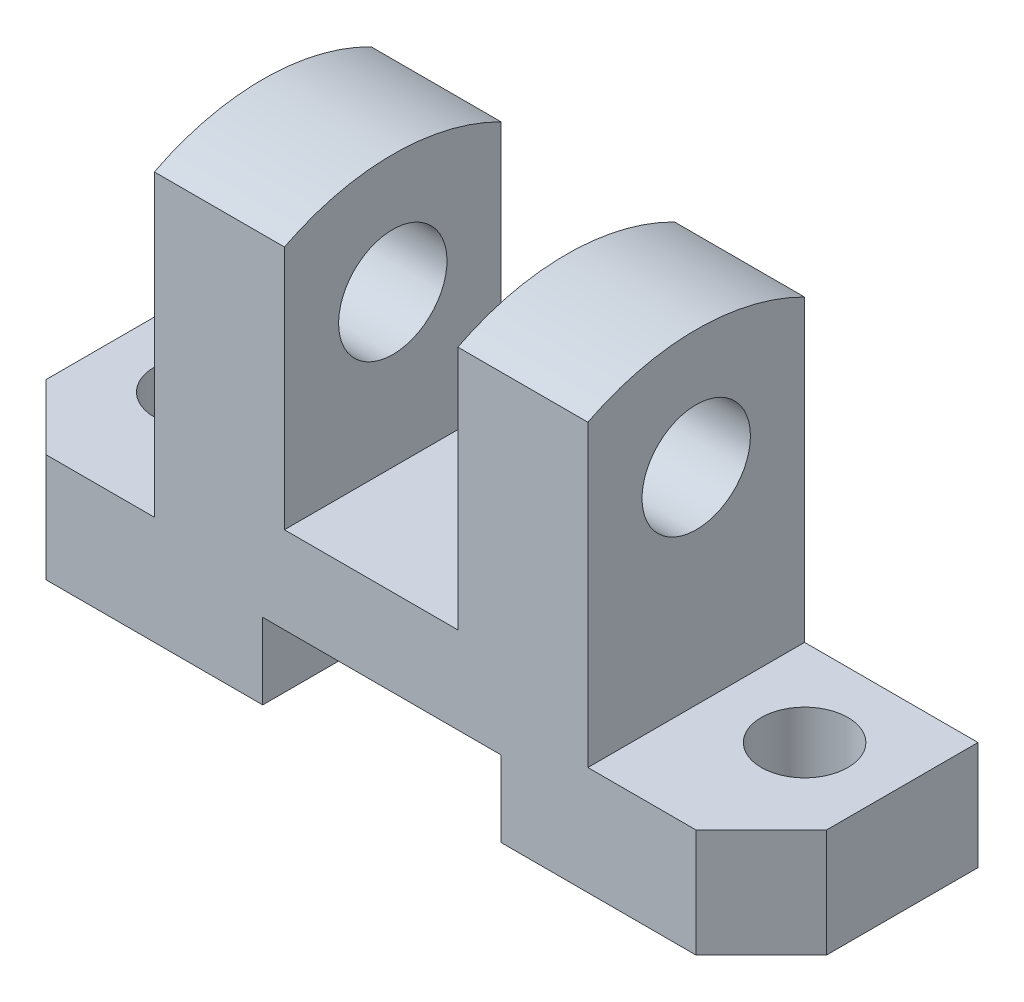
ISO-10303-21;
HEADER;
FILE_DESCRIPTION(('STEP AP214'),'2;1');
FILE_NAME('part.step','',(''),(''),'','','');
FILE_SCHEMA(('AUTOMOTIVE_DESIGN { 1 0 10303 214 1 1 1 1 }'));
ENDSEC;
DATA;
#1=APPLICATION_CONTEXT('core data for automotive mechanical design processes');
#2=APPLICATION_PROTOCOL_DEFINITION('international standard','automotive_design',2000,#1);
#3=PRODUCT_CONTEXT('',#1,'mechanical');
#4=PRODUCT('Part','Part','',(#3));
#5=PRODUCT_RELATED_PRODUCT_CATEGORY('part','',(#4));
#6=PRODUCT_DEFINITION_FORMATION('','',#4);
#7=PRODUCT_DEFINITION_CONTEXT('part definition',#1,'design');
#8=PRODUCT_DEFINITION('design','',#6,#7);
#9=PRODUCT_DEFINITION_SHAPE('','',#8);
#10=(LENGTH_UNIT() NAMED_UNIT(*) SI_UNIT(.MILLI.,.METRE.));
#11=(NAMED_UNIT(*) PLANE_ANGLE_UNIT() SI_UNIT($,.RADIAN.));
#12=(NAMED_UNIT(*) SI_UNIT($,.STERADIAN.) SOLID_ANGLE_UNIT());
#13=UNCERTAINTY_MEASURE_WITH_UNIT(LENGTH_MEASURE(1.E-05),#10,'distance_accuracy_value','');
#14=(GEOMETRIC_REPRESENTATION_CONTEXT(3) GLOBAL_UNCERTAINTY_ASSIGNED_CONTEXT((#13)) GLOBAL_UNIT_ASSIGNED_CONTEXT((#10,
#11,#12)) REPRESENTATION_CONTEXT('',''));
#15=CARTESIAN_POINT('',(0.,0.,0.));
#16=DIRECTION('',(0.,0.,1.));
#17=DIRECTION('',(1.,0.,0.));
#18=AXIS2_PLACEMENT_3D('',#15,#16,#17);
#19=CARTESIAN_POINT('',(25.4,63.5,-15.875));
#20=DIRECTION('',(1.,0.,0.));
#21=DIRECTION('',(0.,1.,0.));
#22=AXIS2_PLACEMENT_3D('',#19,#20,#21);
#23=PLANE('',#22);
#24=CARTESIAN_POINT('',(25.4,46.0375,0.));
#25=DIRECTION('',(1.,0.,0.));
#26=DIRECTION('',(0.,1.,0.));
#27=AXIS2_PLACEMENT_3D('',#24,#25,#26);
#28=CIRCLE('',#27,7.93749999999999);
#29=CARTESIAN_POINT('',(25.4,53.975,0.));
#30=VERTEX_POINT('',#29);
#31=EDGE_CURVE('E401',#30,#30,#28,.T.);
#32=ORIENTED_EDGE('',*,*,#31,.T.);
#33=EDGE_LOOP('',(#32));
#34=FACE_BOUND('',#33,.T.);
#35=DIRECTION('',(0.,1.,0.));
#36=VECTOR('',#35,1.);
#37=CARTESIAN_POINT('',(25.4,63.5,15.875));
#38=LINE('',#37,#36);
#39=CARTESIAN_POINT('',(25.4,15.875,15.875));
#40=VERTEX_POINT('',#39);
#41=CARTESIAN_POINT('',(25.4,59.6835197333464,15.875));
#42=VERTEX_POINT('',#41);
#43=EDGE_CURVE('E196',#40,#42,#38,.T.);
#44=ORIENTED_EDGE('',*,*,#43,.T.);
#45=CARTESIAN_POINT('',(25.4,28.575,0.));
#46=DIRECTION('',(1.,0.,0.));
#47=DIRECTION('',(0.,1.,0.));
#48=AXIS2_PLACEMENT_3D('',#45,#46,#47);
#49=CIRCLE('',#48,34.925);
#50=CARTESIAN_POINT('',(25.4,59.6835197333464,-15.875));
#51=VERTEX_POINT('',#50);
#52=EDGE_CURVE('E189',#42,#51,#49,.F.);
#53=ORIENTED_EDGE('',*,*,#52,.T.);
#54=DIRECTION('',(0.,1.,0.));
#55=VECTOR('',#54,1.);
#56=CARTESIAN_POINT('',(25.4,63.5,-15.875));
#57=LINE('',#56,#55);
#58=CARTESIAN_POINT('',(25.4,15.875,-15.875));
#59=VERTEX_POINT('',#58);
#60=EDGE_CURVE('E242',#59,#51,#57,.T.);
#61=ORIENTED_EDGE('',*,*,#60,.F.);
#62=DIRECTION('',(0.,0.,1.));
#63=VECTOR('',#62,1.);
#64=CARTESIAN_POINT('',(25.4,15.875,-15.875));
#65=LINE('',#64,#63);
#66=EDGE_CURVE('E253',#59,#40,#65,.T.);
#67=ORIENTED_EDGE('',*,*,#66,.T.);
#68=EDGE_LOOP('',(#44,#53,#61,#67));
#69=FACE_BOUND('',#68,.T.);
#70=ADVANCED_FACE('F32',(#34,#69),#23,.F.);
#71=CARTESIAN_POINT('',(44.45,63.5,-15.875));
#72=DIRECTION('',(-1.,0.,0.));
#73=DIRECTION('',(0.,-1.,0.));
#74=AXIS2_PLACEMENT_3D('',#71,#72,#73);
#75=PLANE('',#74);
#76=CARTESIAN_POINT('',(44.45,46.0375,0.));
#77=DIRECTION('',(-1.,0.,0.));
#78=DIRECTION('',(0.,-1.,0.));
#79=AXIS2_PLACEMENT_3D('',#76,#77,#78);
#80=CIRCLE('',#79,7.93749999999999);
#81=CARTESIAN_POINT('',(44.45,38.1,0.));
#82=VERTEX_POINT('',#81);
#83=EDGE_CURVE('E399',#82,#82,#80,.T.);
#84=ORIENTED_EDGE('',*,*,#83,.T.);
#85=EDGE_LOOP('',(#84));
#86=FACE_BOUND('',#85,.T.);
#87=DIRECTION('',(0.,-1.,0.));
#88=VECTOR('',#87,1.);
#89=CARTESIAN_POINT('',(44.45,63.5,-15.875));
#90=LINE('',#89,#88);
#91=CARTESIAN_POINT('',(44.45,59.6835197333464,-15.875));
#92=VERTEX_POINT('',#91);
#93=CARTESIAN_POINT('',(44.45,23.8125,-15.875));
#94=VERTEX_POINT('',#93);
#95=EDGE_CURVE('E198',#92,#94,#90,.T.);
#96=ORIENTED_EDGE('',*,*,#95,.F.);
#97=CARTESIAN_POINT('',(44.45,28.575,0.));
#98=DIRECTION('',(-1.,0.,0.));
#99=DIRECTION('',(0.,-1.,0.));
#100=AXIS2_PLACEMENT_3D('',#97,#98,#99);
#101=CIRCLE('',#100,34.925);
#102=CARTESIAN_POINT('',(44.45,59.6835197333464,15.875));
#103=VERTEX_POINT('',#102);
#104=EDGE_CURVE('E420',#92,#103,#101,.F.);
#105=ORIENTED_EDGE('',*,*,#104,.T.);
#106=DIRECTION('',(0.,-1.,0.));
#107=VECTOR('',#106,1.);
#108=CARTESIAN_POINT('',(44.45,63.5,15.875));
#109=LINE('',#108,#107);
#110=CARTESIAN_POINT('',(44.45,23.8125,15.875));
#111=VERTEX_POINT('',#110);
#112=EDGE_CURVE('E205',#103,#111,#109,.T.);
#113=ORIENTED_EDGE('',*,*,#112,.T.);
#114=DIRECTION('',(0.,0.,1.));
#115=VECTOR('',#114,1.);
#116=CARTESIAN_POINT('',(44.45,23.8125,-15.875));
#117=LINE('',#116,#115);
#118=EDGE_CURVE('E204',#94,#111,#117,.T.);
#119=ORIENTED_EDGE('',*,*,#118,.F.);
#120=EDGE_LOOP('',(#96,#105,#113,#119));
#121=FACE_BOUND('',#120,.T.);
#122=ADVANCED_FACE('F347',(#86,#121),#75,.F.);
#123=CARTESIAN_POINT('',(69.85,63.5,-15.875));
#124=DIRECTION('',(1.,0.,0.));
#125=DIRECTION('',(0.,0.,-1.));
#126=AXIS2_PLACEMENT_3D('',#123,#124,#125);
#127=PLANE('',#126);
#128=CARTESIAN_POINT('',(69.85,46.0375,0.));
#129=DIRECTION('',(1.,0.,0.));
#130=DIRECTION('',(0.,0.,-1.));
#131=AXIS2_PLACEMENT_3D('',#128,#129,#130);
#132=CIRCLE('',#131,7.93749999999999);
#133=CARTESIAN_POINT('',(69.85,46.0375,-7.93749999999999));
#134=VERTEX_POINT('',#133);
#135=EDGE_CURVE('E407',#134,#134,#132,.T.);
#136=ORIENTED_EDGE('',*,*,#135,.T.);
#137=EDGE_LOOP('',(#136));
#138=FACE_BOUND('',#137,.T.);
#139=DIRECTION('',(0.,1.,0.));
#140=VECTOR('',#139,1.);
#141=CARTESIAN_POINT('',(69.85,63.5,15.875));
#142=LINE('',#141,#140);
#143=CARTESIAN_POINT('',(69.85,23.8125,15.875));
#144=VERTEX_POINT('',#143);
#145=CARTESIAN_POINT('',(69.85,59.6835197333464,15.875));
#146=VERTEX_POINT('',#145);
#147=EDGE_CURVE('E201',#144,#146,#142,.T.);
#148=ORIENTED_EDGE('',*,*,#147,.T.);
#149=CARTESIAN_POINT('',(69.85,28.575,0.));
#150=DIRECTION('',(1.,0.,0.));
#151=DIRECTION('',(0.,0.,-1.));
#152=AXIS2_PLACEMENT_3D('',#149,#150,#151);
#153=CIRCLE('',#152,34.925);
#154=CARTESIAN_POINT('',(69.85,59.6835197333464,-15.875));
#155=VERTEX_POINT('',#154);
#156=EDGE_CURVE('E175',#146,#155,#153,.F.);
#157=ORIENTED_EDGE('',*,*,#156,.T.);
#158=DIRECTION('',(0.,1.,0.));
#159=VECTOR('',#158,1.);
#160=CARTESIAN_POINT('',(69.85,63.5,-15.875));
#161=LINE('',#160,#159);
#162=CARTESIAN_POINT('',(69.85,23.8125,-15.875));
#163=VERTEX_POINT('',#162);
#164=EDGE_CURVE('E174',#163,#155,#161,.T.);
#165=ORIENTED_EDGE('',*,*,#164,.F.);
#166=DIRECTION('',(0.,0.,1.));
#167=VECTOR('',#166,1.);
#168=CARTESIAN_POINT('',(69.85,23.8125,-15.875));
#169=LINE('',#168,#167);
#170=EDGE_CURVE('E192',#163,#144,#169,.T.);
#171=ORIENTED_EDGE('',*,*,#170,.T.);
#172=EDGE_LOOP('',(#148,#157,#165,#171));
#173=FACE_BOUND('',#172,.T.);
#174=ADVANCED_FACE('F353',(#138,#173),#127,.F.);
#175=CARTESIAN_POINT('',(88.9,63.5,-15.875));
#176=DIRECTION('',(-1.,0.,0.));
#177=DIRECTION('',(0.,0.,1.));
#178=AXIS2_PLACEMENT_3D('',#175,#176,#177);
#179=PLANE('',#178);
#180=CARTESIAN_POINT('',(88.9,46.0375,0.));
#181=DIRECTION('',(1.,0.,0.));
#182=DIRECTION('',(0.,0.,-1.));
#183=AXIS2_PLACEMENT_3D('',#180,#181,#182);
#184=CIRCLE('',#183,7.93749999999999);
#185=CARTESIAN_POINT('',(88.9,46.0375,-7.93749999999999));
#186=VERTEX_POINT('',#185);
#187=EDGE_CURVE('E588',#186,#186,#184,.T.);
#188=ORIENTED_EDGE('',*,*,#187,.F.);
#189=EDGE_LOOP('',(#188));
#190=FACE_BOUND('',#189,.T.);
#191=DIRECTION('',(0.,-1.,0.));
#192=VECTOR('',#191,1.);
#193=CARTESIAN_POINT('',(88.9,63.5,-15.875));
#194=LINE('',#193,#192);
#195=CARTESIAN_POINT('',(88.9,59.6835197333464,-15.875));
#196=VERTEX_POINT('',#195);
#197=CARTESIAN_POINT('',(88.9,15.875,-15.875));
#198=VERTEX_POINT('',#197);
#199=EDGE_CURVE('E171',#196,#198,#194,.T.);
#200=ORIENTED_EDGE('',*,*,#199,.F.);
#201=CARTESIAN_POINT('',(88.9,28.575,0.));
#202=DIRECTION('',(-1.,0.,0.));
#203=DIRECTION('',(0.,0.,1.));
#204=AXIS2_PLACEMENT_3D('',#201,#202,#203);
#205=CIRCLE('',#204,34.925);
#206=CARTESIAN_POINT('',(88.9,59.6835197333464,15.875));
#207=VERTEX_POINT('',#206);
#208=EDGE_CURVE('E154',#196,#207,#205,.F.);
#209=ORIENTED_EDGE('',*,*,#208,.T.);
#210=DIRECTION('',(0.,-1.,0.));
#211=VECTOR('',#210,1.);
#212=CARTESIAN_POINT('',(88.9,63.5,15.875));
#213=LINE('',#212,#211);
#214=CARTESIAN_POINT('',(88.9,15.875,15.875));
#215=VERTEX_POINT('',#214);
#216=EDGE_CURVE('E186',#207,#215,#213,.T.);
#217=ORIENTED_EDGE('',*,*,#216,.T.);
#218=DIRECTION('',(0.,0.,1.));
#219=VECTOR('',#218,1.);
#220=CARTESIAN_POINT('',(88.9,15.875,-15.875));
#221=LINE('',#220,#219);
#222=EDGE_CURVE('E181',#198,#215,#221,.T.);
#223=ORIENTED_EDGE('',*,*,#222,.F.);
#224=EDGE_LOOP('',(#200,#209,#217,#223));
#225=FACE_BOUND('',#224,.T.);
#226=ADVANCED_FACE('F179',(#190,#225),#179,.F.);
#227=CARTESIAN_POINT('',(0.,0.,15.875));
#228=DIRECTION('',(0.,1.,0.));
#229=DIRECTION('',(0.,0.,1.));
#230=AXIS2_PLACEMENT_3D('',#227,#228,#229);
#231=PLANE('',#230);
#232=CARTESIAN_POINT('',(12.7,0.,-3.175));
#233=DIRECTION('',(0.,1.,0.));
#234=DIRECTION('',(0.,0.,1.));
#235=AXIS2_PLACEMENT_3D('',#232,#233,#234);
#236=CIRCLE('',#235,6.35);
#237=CARTESIAN_POINT('',(12.7,0.,3.175));
#238=VERTEX_POINT('',#237);
#239=EDGE_CURVE('E416',#238,#238,#236,.T.);
#240=ORIENTED_EDGE('',*,*,#239,.T.);
#241=EDGE_LOOP('',(#240));
#242=FACE_BOUND('',#241,.T.);
#243=DIRECTION('',(1.,0.,0.));
#244=VECTOR('',#243,1.);
#245=CARTESIAN_POINT('',(0.,0.,15.875));
#246=LINE('',#245,#244);
#247=CARTESIAN_POINT('',(9.525,0.,15.875));
#248=VERTEX_POINT('',#247);
#249=CARTESIAN_POINT('',(41.275,0.,15.875));
#250=VERTEX_POINT('',#249);
#251=EDGE_CURVE('E259',#248,#250,#246,.T.);
#252=ORIENTED_EDGE('',*,*,#251,.F.);
#253=DIRECTION('',(0.707106781186546,0.,0.707106781186549));
#254=VECTOR('',#253,1.);
#255=CARTESIAN_POINT('',(9.525,0.,15.875));
#256=LINE('',#255,#254);
#257=CARTESIAN_POINT('',(0.,0.,6.34999999999997));
#258=VERTEX_POINT('',#257);
#259=EDGE_CURVE('E279',#248,#258,#256,.F.);
#260=ORIENTED_EDGE('',*,*,#259,.T.);
#261=DIRECTION('',(0.,0.,-1.));
#262=VECTOR('',#261,1.);
#263=CARTESIAN_POINT('',(0.,0.,15.875));
#264=LINE('',#263,#262);
#265=CARTESIAN_POINT('',(0.,0.,-15.875));
#266=VERTEX_POINT('',#265);
#267=EDGE_CURVE('E165',#258,#266,#264,.T.);
#268=ORIENTED_EDGE('',*,*,#267,.T.);
#269=DIRECTION('',(1.,0.,0.));
#270=VECTOR('',#269,1.);
#271=CARTESIAN_POINT('',(0.,0.,-15.875));
#272=LINE('',#271,#270);
#273=CARTESIAN_POINT('',(41.275,0.,-15.875));
#274=VERTEX_POINT('',#273);
#275=EDGE_CURVE('E266',#266,#274,#272,.T.);
#276=ORIENTED_EDGE('',*,*,#275,.T.);
#277=DIRECTION('',(0.,0.,1.));
#278=VECTOR('',#277,1.);
#279=CARTESIAN_POINT('',(41.275,0.,-15.875));
#280=LINE('',#279,#278);
#281=EDGE_CURVE('E226',#274,#250,#280,.T.);
#282=ORIENTED_EDGE('',*,*,#281,.T.);
#283=EDGE_LOOP('',(#252,#260,#268,#276,#282));
#284=FACE_BOUND('',#283,.T.);
#285=ADVANCED_FACE('F302',(#242,#284),#231,.F.);
#286=CARTESIAN_POINT('',(0.,0.,15.875));
#287=DIRECTION('',(1.,0.,0.));
#288=DIRECTION('',(0.,0.,-1.));
#289=AXIS2_PLACEMENT_3D('',#286,#287,#288);
#290=PLANE('',#289);
#291=ORIENTED_EDGE('',*,*,#267,.F.);
#292=DIRECTION('',(0.,1.,0.));
#293=VECTOR('',#292,1.);
#294=CARTESIAN_POINT('',(0.,0.,6.34999999999997));
#295=LINE('',#294,#293);
#296=CARTESIAN_POINT('',(0.,15.875,6.34999999999997));
#297=VERTEX_POINT('',#296);
#298=EDGE_CURVE('E281',#258,#297,#295,.T.);
#299=ORIENTED_EDGE('',*,*,#298,.T.);
#300=DIRECTION('',(0.,0.,1.));
#301=VECTOR('',#300,1.);
#302=CARTESIAN_POINT('',(0.,15.875,-15.875));
#303=LINE('',#302,#301);
#304=CARTESIAN_POINT('',(0.,15.875,-15.875));
#305=VERTEX_POINT('',#304);
#306=EDGE_CURVE('E249',#305,#297,#303,.T.);
#307=ORIENTED_EDGE('',*,*,#306,.F.);
#308=DIRECTION('',(0.,-1.,0.));
#309=VECTOR('',#308,1.);
#310=CARTESIAN_POINT('',(0.,0.,-15.875));
#311=LINE('',#310,#309);
#312=EDGE_CURVE('E256',#305,#266,#311,.T.);
#313=ORIENTED_EDGE('',*,*,#312,.T.);
#314=EDGE_LOOP('',(#291,#299,#307,#313));
#315=FACE_BOUND('',#314,.T.);
#316=ADVANCED_FACE('F304',(#315),#290,.F.);
#317=CARTESIAN_POINT('',(101.6,0.,-3.175));
#318=DIRECTION('',(0.,1.,0.));
#319=DIRECTION('',(0.,0.,1.));
#320=AXIS2_PLACEMENT_3D('',#317,#318,#319);
#321=CIRCLE('',#320,6.34999999999999);
#322=CARTESIAN_POINT('',(101.6,0.,3.17499999999999));
#323=VERTEX_POINT('',#322);
#324=EDGE_CURVE('E405',#323,#323,#321,.T.);
#325=ORIENTED_EDGE('',*,*,#324,.T.);
#326=EDGE_LOOP('',(#325));
#327=FACE_BOUND('',#326,.T.);
#328=DIRECTION('',(0.,0.,-1.));
#329=VECTOR('',#328,1.);
#330=CARTESIAN_POINT('',(114.3,0.,15.875));
#331=LINE('',#330,#329);
#332=CARTESIAN_POINT('',(114.3,0.,6.34999999999997));
#333=VERTEX_POINT('',#332);
#334=CARTESIAN_POINT('',(114.3,0.,-15.875));
#335=VERTEX_POINT('',#334);
#336=EDGE_CURVE('E261',#333,#335,#331,.T.);
#337=ORIENTED_EDGE('',*,*,#336,.F.);
#338=DIRECTION('',(0.707106781186547,0.,-0.707106781186548));
#339=VECTOR('',#338,1.);
#340=CARTESIAN_POINT('',(104.775,0.,15.875));
#341=LINE('',#340,#339);
#342=CARTESIAN_POINT('',(104.775,0.,15.875));
#343=VERTEX_POINT('',#342);
#344=EDGE_CURVE('E11',#333,#343,#341,.F.);
#345=ORIENTED_EDGE('',*,*,#344,.T.);
#346=CARTESIAN_POINT('',(76.2,0.,15.875));
#347=VERTEX_POINT('',#346);
#348=EDGE_CURVE('E262',#347,#343,#246,.T.);
#349=ORIENTED_EDGE('',*,*,#348,.F.);
#350=DIRECTION('',(0.,0.,1.));
#351=VECTOR('',#350,1.);
#352=CARTESIAN_POINT('',(76.2,0.,-15.875));
#353=LINE('',#352,#351);
#354=CARTESIAN_POINT('',(76.2,0.,-15.875));
#355=VERTEX_POINT('',#354);
#356=EDGE_CURVE('E238',#355,#347,#353,.T.);
#357=ORIENTED_EDGE('',*,*,#356,.F.);
#358=EDGE_CURVE('E265',#355,#335,#272,.T.);
#359=ORIENTED_EDGE('',*,*,#358,.T.);
#360=EDGE_LOOP('',(#337,#345,#349,#357,#359));
#361=FACE_BOUND('',#360,.T.);
#362=ADVANCED_FACE('F324',(#327,#361),#231,.F.);
#363=CARTESIAN_POINT('',(114.3,0.,15.875));
#364=DIRECTION('',(-1.,0.,0.));
#365=DIRECTION('',(0.,0.,1.));
#366=AXIS2_PLACEMENT_3D('',#363,#364,#365);
#367=PLANE('',#366);
#368=DIRECTION('',(0.,0.,1.));
#369=VECTOR('',#368,1.);
#370=CARTESIAN_POINT('',(114.3,15.875,-15.875));
#371=LINE('',#370,#369);
#372=CARTESIAN_POINT('',(114.3,15.875,-15.875));
#373=VERTEX_POINT('',#372);
#374=CARTESIAN_POINT('',(114.3,15.875,6.34999999999997));
#375=VERTEX_POINT('',#374);
#376=EDGE_CURVE('E194',#373,#375,#371,.T.);
#377=ORIENTED_EDGE('',*,*,#376,.T.);
#378=DIRECTION('',(0.,-1.,0.));
#379=VECTOR('',#378,1.);
#380=CARTESIAN_POINT('',(114.3,0.,6.34999999999997));
#381=LINE('',#380,#379);
#382=EDGE_CURVE('E40',#375,#333,#381,.T.);
#383=ORIENTED_EDGE('',*,*,#382,.T.);
#384=ORIENTED_EDGE('',*,*,#336,.T.);
#385=DIRECTION('',(0.,1.,0.));
#386=VECTOR('',#385,1.);
#387=CARTESIAN_POINT('',(114.3,0.,-15.875));
#388=LINE('',#387,#386);
#389=EDGE_CURVE('E269',#335,#373,#388,.T.);
#390=ORIENTED_EDGE('',*,*,#389,.T.);
#391=EDGE_LOOP('',(#377,#383,#384,#390));
#392=FACE_BOUND('',#391,.T.);
#393=ADVANCED_FACE('F326',(#392),#367,.F.);
#394=CARTESIAN_POINT('',(0.,63.5,15.875));
#395=DIRECTION('',(0.,0.,-1.));
#396=DIRECTION('',(-1.,0.,0.));
#397=AXIS2_PLACEMENT_3D('',#394,#395,#396);
#398=PLANE('',#397);
#399=DIRECTION('',(1.,0.,0.));
#400=VECTOR('',#399,1.);
#401=CARTESIAN_POINT('',(25.4,15.875,15.875));
#402=LINE('',#401,#400);
#403=CARTESIAN_POINT('',(9.525,15.875,15.875));
#404=VERTEX_POINT('',#403);
#405=EDGE_CURVE('E246',#404,#40,#402,.T.);
#406=ORIENTED_EDGE('',*,*,#405,.F.);
#407=DIRECTION('',(0.,-1.,0.));
#408=VECTOR('',#407,1.);
#409=CARTESIAN_POINT('',(9.525,63.5,15.875));
#410=LINE('',#409,#408);
#411=EDGE_CURVE('E276',#404,#248,#410,.T.);
#412=ORIENTED_EDGE('',*,*,#411,.T.);
#413=ORIENTED_EDGE('',*,*,#251,.T.);
#414=DIRECTION('',(0.,-1.,0.));
#415=VECTOR('',#414,1.);
#416=CARTESIAN_POINT('',(41.275,0.,15.875));
#417=LINE('',#416,#415);
#418=CARTESIAN_POINT('',(41.275,11.1125,15.875));
#419=VERTEX_POINT('',#418);
#420=EDGE_CURVE('E227',#419,#250,#417,.T.);
#421=ORIENTED_EDGE('',*,*,#420,.F.);
#422=DIRECTION('',(-1.,0.,0.));
#423=VECTOR('',#422,1.);
#424=CARTESIAN_POINT('',(41.275,11.1125,15.875));
#425=LINE('',#424,#423);
#426=CARTESIAN_POINT('',(76.2,11.1125,15.875));
#427=VERTEX_POINT('',#426);
#428=EDGE_CURVE('E220',#427,#419,#425,.T.);
#429=ORIENTED_EDGE('',*,*,#428,.F.);
#430=DIRECTION('',(0.,1.,0.));
#431=VECTOR('',#430,1.);
#432=CARTESIAN_POINT('',(76.2,0.,15.875));
#433=LINE('',#432,#431);
#434=EDGE_CURVE('E230',#347,#427,#433,.T.);
#435=ORIENTED_EDGE('',*,*,#434,.F.);
#436=ORIENTED_EDGE('',*,*,#348,.T.);
#437=DIRECTION('',(0.,1.,0.));
#438=VECTOR('',#437,1.);
#439=CARTESIAN_POINT('',(104.775,63.5,15.875));
#440=LINE('',#439,#438);
#441=CARTESIAN_POINT('',(104.775,15.875,15.875));
#442=VERTEX_POINT('',#441);
#443=EDGE_CURVE('E164',#343,#442,#440,.T.);
#444=ORIENTED_EDGE('',*,*,#443,.T.);
#445=DIRECTION('',(1.,0.,0.));
#446=VECTOR('',#445,1.);
#447=CARTESIAN_POINT('',(114.3,15.875,15.875));
#448=LINE('',#447,#446);
#449=EDGE_CURVE('E183',#215,#442,#448,.T.);
#450=ORIENTED_EDGE('',*,*,#449,.F.);
#451=ORIENTED_EDGE('',*,*,#216,.F.);
#452=DIRECTION('',(1.,0.,0.));
#453=VECTOR('',#452,1.);
#454=CARTESIAN_POINT('',(0.,59.6835197333464,15.875));
#455=LINE('',#454,#453);
#456=EDGE_CURVE('E160',#207,#146,#455,.F.);
#457=ORIENTED_EDGE('',*,*,#456,.T.);
#458=ORIENTED_EDGE('',*,*,#147,.F.);
#459=DIRECTION('',(1.,0.,0.));
#460=VECTOR('',#459,1.);
#461=CARTESIAN_POINT('',(44.45,23.8125,15.875));
#462=LINE('',#461,#460);
#463=EDGE_CURVE('E207',#111,#144,#462,.T.);
#464=ORIENTED_EDGE('',*,*,#463,.F.);
#465=ORIENTED_EDGE('',*,*,#112,.F.);
#466=EDGE_CURVE('E421',#103,#42,#455,.F.);
#467=ORIENTED_EDGE('',*,*,#466,.T.);
#468=ORIENTED_EDGE('',*,*,#43,.F.);
#469=EDGE_LOOP('',(#406,#412,#413,#421,#429,#435,#436,#444,#450,#451,#457,#458,#464,#465,#467,#468));
#470=FACE_BOUND('',#469,.T.);
#471=ADVANCED_FACE('F296',(#470),#398,.F.);
#472=CARTESIAN_POINT('',(0.,63.5,-15.875));
#473=DIRECTION('',(0.,0.,-1.));
#474=DIRECTION('',(-1.,0.,0.));
#475=AXIS2_PLACEMENT_3D('',#472,#473,#474);
#476=PLANE('',#475);
#477=DIRECTION('',(1.,0.,0.));
#478=VECTOR('',#477,1.);
#479=CARTESIAN_POINT('',(0.,59.6835197333464,-15.875));
#480=LINE('',#479,#478);
#481=EDGE_CURVE('E157',#196,#155,#480,.F.);
#482=ORIENTED_EDGE('',*,*,#481,.F.);
#483=ORIENTED_EDGE('',*,*,#199,.T.);
#484=DIRECTION('',(1.,0.,0.));
#485=VECTOR('',#484,1.);
#486=CARTESIAN_POINT('',(114.3,15.875,-15.875));
#487=LINE('',#486,#485);
#488=EDGE_CURVE('E182',#198,#373,#487,.T.);
#489=ORIENTED_EDGE('',*,*,#488,.T.);
#490=ORIENTED_EDGE('',*,*,#389,.F.);
#491=ORIENTED_EDGE('',*,*,#358,.F.);
#492=DIRECTION('',(0.,1.,0.));
#493=VECTOR('',#492,1.);
#494=CARTESIAN_POINT('',(76.2,0.,-15.875));
#495=LINE('',#494,#493);
#496=CARTESIAN_POINT('',(76.2,11.1125,-15.875));
#497=VERTEX_POINT('',#496);
#498=EDGE_CURVE('E219',#355,#497,#495,.T.);
#499=ORIENTED_EDGE('',*,*,#498,.T.);
#500=DIRECTION('',(-1.,0.,0.));
#501=VECTOR('',#500,1.);
#502=CARTESIAN_POINT('',(41.275,11.1125,-15.875));
#503=LINE('',#502,#501);
#504=CARTESIAN_POINT('',(41.275,11.1125,-15.875));
#505=VERTEX_POINT('',#504);
#506=EDGE_CURVE('E223',#497,#505,#503,.T.);
#507=ORIENTED_EDGE('',*,*,#506,.T.);
#508=DIRECTION('',(0.,-1.,0.));
#509=VECTOR('',#508,1.);
#510=CARTESIAN_POINT('',(41.275,0.,-15.875));
#511=LINE('',#510,#509);
#512=EDGE_CURVE('E216',#505,#274,#511,.T.);
#513=ORIENTED_EDGE('',*,*,#512,.T.);
#514=ORIENTED_EDGE('',*,*,#275,.F.);
#515=ORIENTED_EDGE('',*,*,#312,.F.);
#516=DIRECTION('',(1.,0.,0.));
#517=VECTOR('',#516,1.);
#518=CARTESIAN_POINT('',(25.4,15.875,-15.875));
#519=LINE('',#518,#517);
#520=EDGE_CURVE('E245',#305,#59,#519,.T.);
#521=ORIENTED_EDGE('',*,*,#520,.T.);
#522=ORIENTED_EDGE('',*,*,#60,.T.);
#523=EDGE_CURVE('E177',#92,#51,#480,.F.);
#524=ORIENTED_EDGE('',*,*,#523,.F.);
#525=ORIENTED_EDGE('',*,*,#95,.T.);
#526=DIRECTION('',(1.,0.,0.));
#527=VECTOR('',#526,1.);
#528=CARTESIAN_POINT('',(44.45,23.8125,-15.875));
#529=LINE('',#528,#527);
#530=EDGE_CURVE('E200',#94,#163,#529,.T.);
#531=ORIENTED_EDGE('',*,*,#530,.T.);
#532=ORIENTED_EDGE('',*,*,#164,.T.);
#533=EDGE_LOOP('',(#482,#483,#489,#490,#491,#499,#507,#513,#514,#515,#521,#522,#524,#525,#531,#532));
#534=FACE_BOUND('',#533,.T.);
#535=ADVANCED_FACE('F169',(#534),#476,.T.);
#536=CARTESIAN_POINT('',(25.4,15.875,-15.875));
#537=DIRECTION('',(0.,-1.,0.));
#538=DIRECTION('',(1.,0.,0.));
#539=AXIS2_PLACEMENT_3D('',#536,#537,#538);
#540=PLANE('',#539);
#541=CARTESIAN_POINT('',(12.7,15.875,-3.175));
#542=DIRECTION('',(0.,1.,0.));
#543=DIRECTION('',(0.,0.,1.));
#544=AXIS2_PLACEMENT_3D('',#541,#542,#543);
#545=CIRCLE('',#544,6.34999999999999);
#546=CARTESIAN_POINT('',(12.7,15.875,3.17499999999999));
#547=VERTEX_POINT('',#546);
#548=EDGE_CURVE('E413',#547,#547,#545,.T.);
#549=ORIENTED_EDGE('',*,*,#548,.F.);
#550=EDGE_LOOP('',(#549));
#551=FACE_BOUND('',#550,.T.);
#552=ORIENTED_EDGE('',*,*,#306,.T.);
#553=DIRECTION('',(-0.707106781186546,0.,-0.707106781186549));
#554=VECTOR('',#553,1.);
#555=CARTESIAN_POINT('',(9.525,15.875,15.875));
#556=LINE('',#555,#554);
#557=EDGE_CURVE('E283',#297,#404,#556,.F.);
#558=ORIENTED_EDGE('',*,*,#557,.T.);
#559=ORIENTED_EDGE('',*,*,#405,.T.);
#560=ORIENTED_EDGE('',*,*,#66,.F.);
#561=ORIENTED_EDGE('',*,*,#520,.F.);
#562=EDGE_LOOP('',(#552,#558,#559,#560,#561));
#563=FACE_BOUND('',#562,.T.);
#564=ADVANCED_FACE('F288',(#551,#563),#540,.F.);
#565=CARTESIAN_POINT('',(41.275,0.,-15.875));
#566=DIRECTION('',(-1.,0.,0.));
#567=DIRECTION('',(0.,0.,1.));
#568=AXIS2_PLACEMENT_3D('',#565,#566,#567);
#569=PLANE('',#568);
#570=ORIENTED_EDGE('',*,*,#420,.T.);
#571=ORIENTED_EDGE('',*,*,#281,.F.);
#572=ORIENTED_EDGE('',*,*,#512,.F.);
#573=DIRECTION('',(0.,0.,1.));
#574=VECTOR('',#573,1.);
#575=CARTESIAN_POINT('',(41.275,11.1125,-15.875));
#576=LINE('',#575,#574);
#577=EDGE_CURVE('E208',#505,#419,#576,.T.);
#578=ORIENTED_EDGE('',*,*,#577,.T.);
#579=EDGE_LOOP('',(#570,#571,#572,#578));
#580=FACE_BOUND('',#579,.T.);
#581=ADVANCED_FACE('F309',(#580),#569,.F.);
#582=CARTESIAN_POINT('',(41.275,11.1125,-15.875));
#583=DIRECTION('',(0.,1.,0.));
#584=DIRECTION('',(0.,0.,1.));
#585=AXIS2_PLACEMENT_3D('',#582,#583,#584);
#586=PLANE('',#585);
#587=ORIENTED_EDGE('',*,*,#428,.T.);
#588=ORIENTED_EDGE('',*,*,#577,.F.);
#589=ORIENTED_EDGE('',*,*,#506,.F.);
#590=DIRECTION('',(0.,0.,1.));
#591=VECTOR('',#590,1.);
#592=CARTESIAN_POINT('',(76.2,11.1125,-15.875));
#593=LINE('',#592,#591);
#594=EDGE_CURVE('E236',#497,#427,#593,.T.);
#595=ORIENTED_EDGE('',*,*,#594,.T.);
#596=EDGE_LOOP('',(#587,#588,#589,#595));
#597=FACE_BOUND('',#596,.T.);
#598=ADVANCED_FACE('F316',(#597),#586,.F.);
#599=CARTESIAN_POINT('',(76.2,0.,-15.875));
#600=DIRECTION('',(1.,0.,0.));
#601=DIRECTION('',(0.,0.,-1.));
#602=AXIS2_PLACEMENT_3D('',#599,#600,#601);
#603=PLANE('',#602);
#604=ORIENTED_EDGE('',*,*,#434,.T.);
#605=ORIENTED_EDGE('',*,*,#594,.F.);
#606=ORIENTED_EDGE('',*,*,#498,.F.);
#607=ORIENTED_EDGE('',*,*,#356,.T.);
#608=EDGE_LOOP('',(#604,#605,#606,#607));
#609=FACE_BOUND('',#608,.T.);
#610=ADVANCED_FACE('F319',(#609),#603,.F.);
#611=CARTESIAN_POINT('',(44.45,23.8125,-15.875));
#612=DIRECTION('',(0.,-1.,0.));
#613=DIRECTION('',(0.,0.,-1.));
#614=AXIS2_PLACEMENT_3D('',#611,#612,#613);
#615=PLANE('',#614);
#616=ORIENTED_EDGE('',*,*,#463,.T.);
#617=ORIENTED_EDGE('',*,*,#170,.F.);
#618=ORIENTED_EDGE('',*,*,#530,.F.);
#619=ORIENTED_EDGE('',*,*,#118,.T.);
#620=EDGE_LOOP('',(#616,#617,#618,#619));
#621=FACE_BOUND('',#620,.T.);
#622=ADVANCED_FACE('F333',(#621),#615,.F.);
#623=CARTESIAN_POINT('',(114.3,15.875,-15.875));
#624=DIRECTION('',(0.,-1.,0.));
#625=DIRECTION('',(1.,0.,0.));
#626=AXIS2_PLACEMENT_3D('',#623,#624,#625);
#627=PLANE('',#626);
#628=CARTESIAN_POINT('',(101.6,15.875,-3.175));
#629=DIRECTION('',(0.,1.,0.));
#630=DIRECTION('',(0.,0.,1.));
#631=AXIS2_PLACEMENT_3D('',#628,#629,#630);
#632=CIRCLE('',#631,6.34999999999999);
#633=CARTESIAN_POINT('',(101.6,15.875,3.17499999999999));
#634=VERTEX_POINT('',#633);
#635=EDGE_CURVE('E402',#634,#634,#632,.T.);
#636=ORIENTED_EDGE('',*,*,#635,.F.);
#637=EDGE_LOOP('',(#636));
#638=FACE_BOUND('',#637,.T.);
#639=ORIENTED_EDGE('',*,*,#449,.T.);
#640=DIRECTION('',(-0.707106781186547,0.,0.707106781186548));
#641=VECTOR('',#640,1.);
#642=CARTESIAN_POINT('',(104.775,15.875,15.875));
#643=LINE('',#642,#641);
#644=EDGE_CURVE('E54',#442,#375,#643,.F.);
#645=ORIENTED_EDGE('',*,*,#644,.T.);
#646=ORIENTED_EDGE('',*,*,#376,.F.);
#647=ORIENTED_EDGE('',*,*,#488,.F.);
#648=ORIENTED_EDGE('',*,*,#222,.T.);
#649=EDGE_LOOP('',(#639,#645,#646,#647,#648));
#650=FACE_BOUND('',#649,.T.);
#651=ADVANCED_FACE('F331',(#638,#650),#627,.F.);
#652=CARTESIAN_POINT('',(0.,28.575,0.));
#653=DIRECTION('',(1.,0.,0.));
#654=DIRECTION('',(0.,0.,-1.));
#655=AXIS2_PLACEMENT_3D('',#652,#653,#654);
#656=CYLINDRICAL_SURFACE('',#655,34.925);
#657=ORIENTED_EDGE('',*,*,#208,.F.);
#658=ORIENTED_EDGE('',*,*,#481,.T.);
#659=ORIENTED_EDGE('',*,*,#156,.F.);
#660=ORIENTED_EDGE('',*,*,#456,.F.);
#661=EDGE_LOOP('',(#657,#658,#659,#660));
#662=FACE_BOUND('',#661,.T.);
#663=ADVANCED_FACE('F156',(#662),#656,.T.);
#664=ORIENTED_EDGE('',*,*,#104,.F.);
#665=ORIENTED_EDGE('',*,*,#523,.T.);
#666=ORIENTED_EDGE('',*,*,#52,.F.);
#667=ORIENTED_EDGE('',*,*,#466,.F.);
#668=EDGE_LOOP('',(#664,#665,#666,#667));
#669=FACE_BOUND('',#668,.T.);
#670=ADVANCED_FACE('F340',(#669),#656,.T.);
#671=CARTESIAN_POINT('',(9.525,63.5,15.875));
#672=DIRECTION('',(0.707106781186549,0.,-0.707106781186546));
#673=DIRECTION('',(-0.707106781186546,0.,-0.707106781186549));
#674=AXIS2_PLACEMENT_3D('',#671,#672,#673);
#675=PLANE('',#674);
#676=ORIENTED_EDGE('',*,*,#557,.F.);
#677=ORIENTED_EDGE('',*,*,#298,.F.);
#678=ORIENTED_EDGE('',*,*,#259,.F.);
#679=ORIENTED_EDGE('',*,*,#411,.F.);
#680=EDGE_LOOP('',(#676,#677,#678,#679));
#681=FACE_BOUND('',#680,.T.);
#682=ADVANCED_FACE('F299',(#681),#675,.F.);
#683=CARTESIAN_POINT('',(104.775,63.5,15.875));
#684=DIRECTION('',(-0.707106781186548,0.,-0.707106781186547));
#685=DIRECTION('',(-0.707106781186547,0.,0.707106781186548));
#686=AXIS2_PLACEMENT_3D('',#683,#684,#685);
#687=PLANE('',#686);
#688=ORIENTED_EDGE('',*,*,#344,.F.);
#689=ORIENTED_EDGE('',*,*,#382,.F.);
#690=ORIENTED_EDGE('',*,*,#644,.F.);
#691=ORIENTED_EDGE('',*,*,#443,.F.);
#692=EDGE_LOOP('',(#688,#689,#690,#691));
#693=FACE_BOUND('',#692,.T.);
#694=ADVANCED_FACE('F34',(#693),#687,.F.);
#695=CARTESIAN_POINT('',(12.7,15.875,-3.175));
#696=DIRECTION('',(0.,1.,0.));
#697=DIRECTION('',(0.,0.,1.));
#698=AXIS2_PLACEMENT_3D('',#695,#696,#697);
#699=CYLINDRICAL_SURFACE('',#698,6.34999999999999);
#700=ORIENTED_EDGE('',*,*,#239,.F.);
#701=EDGE_LOOP('',(#700));
#702=FACE_BOUND('',#701,.T.);
#703=ORIENTED_EDGE('',*,*,#548,.T.);
#704=EDGE_LOOP('',(#703));
#705=FACE_BOUND('',#704,.T.);
#706=ADVANCED_FACE('F376',(#702,#705),#699,.F.);
#707=CARTESIAN_POINT('',(101.6,15.875,-3.175));
#708=DIRECTION('',(0.,1.,0.));
#709=DIRECTION('',(0.,0.,1.));
#710=AXIS2_PLACEMENT_3D('',#707,#708,#709);
#711=CYLINDRICAL_SURFACE('',#710,6.34999999999999);
#712=ORIENTED_EDGE('',*,*,#324,.F.);
#713=EDGE_LOOP('',(#712));
#714=FACE_BOUND('',#713,.T.);
#715=ORIENTED_EDGE('',*,*,#635,.T.);
#716=EDGE_LOOP('',(#715));
#717=FACE_BOUND('',#716,.T.);
#718=ADVANCED_FACE('F383',(#714,#717),#711,.F.);
#719=CARTESIAN_POINT('',(88.9,46.0375,0.));
#720=DIRECTION('',(1.,0.,0.));
#721=DIRECTION('',(0.,0.,-1.));
#722=AXIS2_PLACEMENT_3D('',#719,#720,#721);
#723=CYLINDRICAL_SURFACE('',#722,7.93749999999999);
#724=ORIENTED_EDGE('',*,*,#187,.T.);
#725=EDGE_LOOP('',(#724));
#726=FACE_BOUND('',#725,.T.);
#727=ORIENTED_EDGE('',*,*,#135,.F.);
#728=EDGE_LOOP('',(#727));
#729=FACE_BOUND('',#728,.T.);
#730=ADVANCED_FACE('F387',(#726,#729),#723,.F.);
#731=ORIENTED_EDGE('',*,*,#83,.F.);
#732=EDGE_LOOP('',(#731));
#733=FACE_BOUND('',#732,.T.);
#734=ORIENTED_EDGE('',*,*,#31,.F.);
#735=EDGE_LOOP('',(#734));
#736=FACE_BOUND('',#735,.T.);
#737=ADVANCED_FACE('F389',(#733,#736),#723,.F.);
#738=CLOSED_SHELL('',(#70,#122,#174,#226,#285,#316,#362,#393,#471,#535,#564,#581,#598,#610,#622,
#651,#663,#670,#682,#694,#706,#718,#730,#737));
#739=MANIFOLD_SOLID_BREP('B2',#738);
#740=ADVANCED_BREP_SHAPE_REPRESENTATION('',(#18,#739),#14);
#741=SHAPE_DEFINITION_REPRESENTATION(#9,#740);
ENDSEC;
END-ISO-10303-21;
